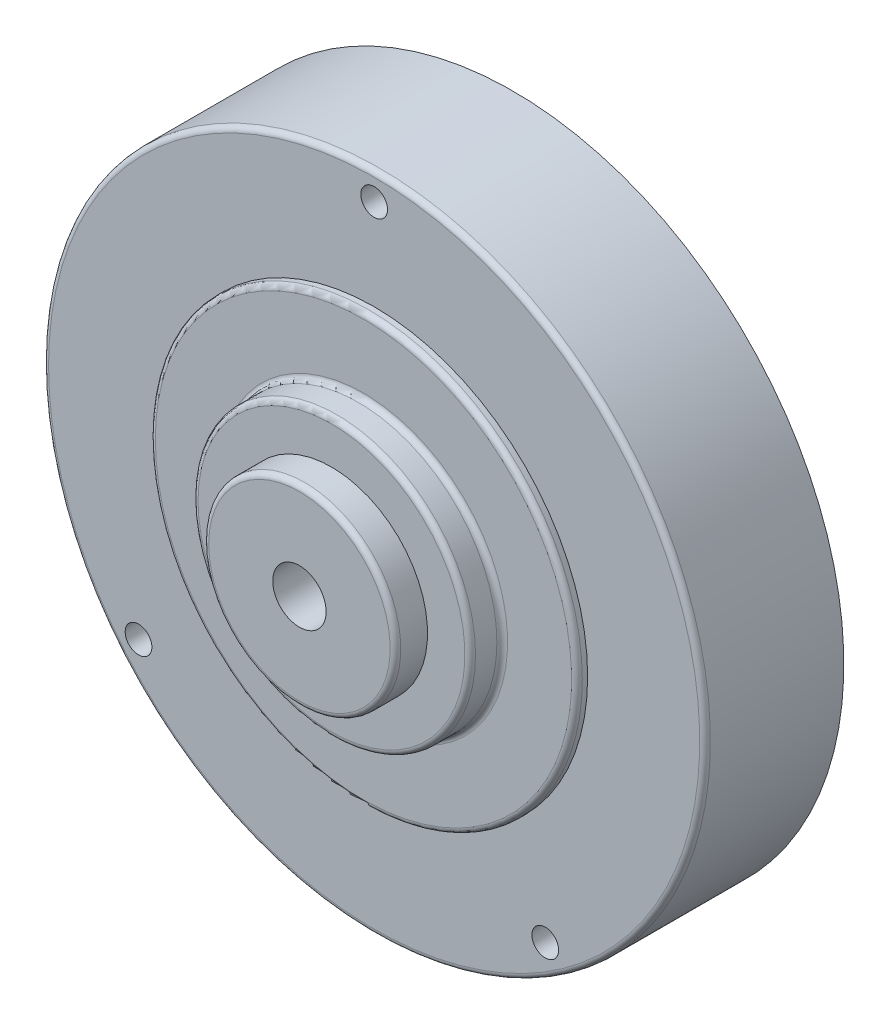
ISO-10303-21;
HEADER;
FILE_DESCRIPTION(('STEP AP214'),'2;1');
FILE_NAME('part.step','',(''),(''),'','','');
FILE_SCHEMA(('AUTOMOTIVE_DESIGN { 1 0 10303 214 1 1 1 1 }'));
ENDSEC;
DATA;
#1=APPLICATION_CONTEXT('core data for automotive mechanical design processes');
#2=APPLICATION_PROTOCOL_DEFINITION('international standard','automotive_design',2000,#1);
#3=PRODUCT_CONTEXT('',#1,'mechanical');
#4=PRODUCT('Part','Part','',(#3));
#5=PRODUCT_RELATED_PRODUCT_CATEGORY('part','',(#4));
#6=PRODUCT_DEFINITION_FORMATION('','',#4);
#7=PRODUCT_DEFINITION_CONTEXT('part definition',#1,'design');
#8=PRODUCT_DEFINITION('design','',#6,#7);
#9=PRODUCT_DEFINITION_SHAPE('','',#8);
#10=(LENGTH_UNIT() NAMED_UNIT(*) SI_UNIT(.MILLI.,.METRE.));
#11=(NAMED_UNIT(*) PLANE_ANGLE_UNIT() SI_UNIT($,.RADIAN.));
#12=(NAMED_UNIT(*) SI_UNIT($,.STERADIAN.) SOLID_ANGLE_UNIT());
#13=UNCERTAINTY_MEASURE_WITH_UNIT(LENGTH_MEASURE(1.E-05),#10,'distance_accuracy_value','');
#14=(GEOMETRIC_REPRESENTATION_CONTEXT(3) GLOBAL_UNCERTAINTY_ASSIGNED_CONTEXT((#13)) GLOBAL_UNIT_ASSIGNED_CONTEXT((#10,
#11,#12)) REPRESENTATION_CONTEXT('',''));
#15=CARTESIAN_POINT('',(0.,0.,0.));
#16=DIRECTION('',(0.,0.,1.));
#17=DIRECTION('',(1.,0.,0.));
#18=AXIS2_PLACEMENT_3D('',#15,#16,#17);
#19=CARTESIAN_POINT('',(0.,0.,0.));
#20=DIRECTION('',(0.,0.,1.));
#21=DIRECTION('',(1.,0.,0.));
#22=AXIS2_PLACEMENT_3D('',#19,#20,#21);
#23=PLANE('',#22);
#24=CARTESIAN_POINT('',(0.,0.,0.));
#25=DIRECTION('',(0.,0.,1.));
#26=DIRECTION('',(1.,0.,0.));
#27=AXIS2_PLACEMENT_3D('',#24,#25,#26);
#28=CIRCLE('',#27,2.5);
#29=CARTESIAN_POINT('',(2.5,0.,0.));
#30=VERTEX_POINT('',#29);
#31=EDGE_CURVE('E77',#30,#30,#28,.T.);
#32=ORIENTED_EDGE('',*,*,#31,.T.);
#33=EDGE_LOOP('',(#32));
#34=FACE_BOUND('',#33,.T.);
#35=CARTESIAN_POINT('',(0.,0.,0.));
#36=DIRECTION('',(0.,0.,-1.));
#37=DIRECTION('',(-1.,0.,0.));
#38=AXIS2_PLACEMENT_3D('',#35,#36,#37);
#39=CIRCLE('',#38,31.);
#40=CARTESIAN_POINT('',(-31.,0.,0.));
#41=VERTEX_POINT('',#40);
#42=EDGE_CURVE('E68',#41,#41,#39,.T.);
#43=ORIENTED_EDGE('',*,*,#42,.T.);
#44=EDGE_LOOP('',(#43));
#45=FACE_BOUND('',#44,.T.);
#46=ADVANCED_FACE('F30',(#34,#45),#23,.F.);
#47=CARTESIAN_POINT('',(0.,0.,0.));
#48=DIRECTION('',(0.,0.,-1.));
#49=DIRECTION('',(-1.,0.,0.));
#50=AXIS2_PLACEMENT_3D('',#47,#48,#49);
#51=CYLINDRICAL_SURFACE('',#50,31.);
#52=CARTESIAN_POINT('',(0.,0.,12.5));
#53=DIRECTION('',(0.,0.,-1.));
#54=DIRECTION('',(-1.,0.,0.));
#55=AXIS2_PLACEMENT_3D('',#52,#53,#54);
#56=CIRCLE('',#55,31.);
#57=CARTESIAN_POINT('',(-31.,0.,12.5));
#58=VERTEX_POINT('',#57);
#59=EDGE_CURVE('E37',#58,#58,#56,.T.);
#60=ORIENTED_EDGE('',*,*,#59,.T.);
#61=EDGE_LOOP('',(#60));
#62=FACE_BOUND('',#61,.T.);
#63=ORIENTED_EDGE('',*,*,#42,.F.);
#64=EDGE_LOOP('',(#63));
#65=FACE_BOUND('',#64,.T.);
#66=ADVANCED_FACE('F115',(#62,#65),#51,.T.);
#67=CARTESIAN_POINT('',(31.,0.,13.));
#68=DIRECTION('',(0.,0.,-1.));
#69=DIRECTION('',(-1.,0.,0.));
#70=AXIS2_PLACEMENT_3D('',#67,#68,#69);
#71=PLANE('',#70);
#72=CARTESIAN_POINT('',(16.0287564116208,-23.5654188992457,13.));
#73=DIRECTION('',(0.,0.,1.));
#74=DIRECTION('',(1.,0.,0.));
#75=AXIS2_PLACEMENT_3D('',#72,#73,#74);
#76=CIRCLE('',#75,1.25);
#77=CARTESIAN_POINT('',(17.2787564116208,-23.5654188992457,13.));
#78=VERTEX_POINT('',#77);
#79=EDGE_CURVE('E96',#78,#78,#76,.T.);
#80=ORIENTED_EDGE('',*,*,#79,.F.);
#81=EDGE_LOOP('',(#80));
#82=FACE_BOUND('',#81,.T.);
#83=CARTESIAN_POINT('',(-22.0713342198514,-18.030701754386,13.));
#84=DIRECTION('',(0.,0.,1.));
#85=DIRECTION('',(1.,0.,0.));
#86=AXIS2_PLACEMENT_3D('',#83,#84,#85);
#87=CIRCLE('',#86,1.25);
#88=CARTESIAN_POINT('',(-20.8213342198514,-18.030701754386,13.));
#89=VERTEX_POINT('',#88);
#90=EDGE_CURVE('E90',#89,#89,#87,.T.);
#91=ORIENTED_EDGE('',*,*,#90,.F.);
#92=EDGE_LOOP('',(#91));
#93=FACE_BOUND('',#92,.T.);
#94=CARTESIAN_POINT('',(0.,28.5,13.));
#95=DIRECTION('',(0.,0.,1.));
#96=DIRECTION('',(1.,0.,0.));
#97=AXIS2_PLACEMENT_3D('',#94,#95,#96);
#98=CIRCLE('',#97,1.25);
#99=CARTESIAN_POINT('',(1.25,28.5,13.));
#100=VERTEX_POINT('',#99);
#101=EDGE_CURVE('E84',#100,#100,#98,.T.);
#102=ORIENTED_EDGE('',*,*,#101,.F.);
#103=EDGE_LOOP('',(#102));
#104=FACE_BOUND('',#103,.T.);
#105=CARTESIAN_POINT('',(0.,0.,13.));
#106=DIRECTION('',(0.,0.,-1.));
#107=DIRECTION('',(-1.,0.,0.));
#108=AXIS2_PLACEMENT_3D('',#105,#106,#107);
#109=CIRCLE('',#108,30.5);
#110=CARTESIAN_POINT('',(-30.5,0.,13.));
#111=VERTEX_POINT('',#110);
#112=EDGE_CURVE('E10',#111,#111,#109,.F.);
#113=ORIENTED_EDGE('',*,*,#112,.T.);
#114=EDGE_LOOP('',(#113));
#115=FACE_BOUND('',#114,.T.);
#116=CARTESIAN_POINT('',(0.,0.,13.));
#117=DIRECTION('',(0.,0.,-1.));
#118=DIRECTION('',(-1.,0.,0.));
#119=AXIS2_PLACEMENT_3D('',#116,#117,#118);
#120=CIRCLE('',#119,20.);
#121=CARTESIAN_POINT('',(-20.,0.,13.));
#122=VERTEX_POINT('',#121);
#123=EDGE_CURVE('E71',#122,#122,#120,.T.);
#124=ORIENTED_EDGE('',*,*,#123,.T.);
#125=EDGE_LOOP('',(#124));
#126=FACE_BOUND('',#125,.T.);
#127=ADVANCED_FACE('F111',(#82,#93,#104,#115,#126),#71,.F.);
#128=CARTESIAN_POINT('',(0.,0.,0.));
#129=DIRECTION('',(0.,0.,-1.));
#130=DIRECTION('',(-1.,0.,0.));
#131=AXIS2_PLACEMENT_3D('',#128,#129,#130);
#132=CYLINDRICAL_SURFACE('',#131,20.);
#133=CARTESIAN_POINT('',(0.,0.,13.5));
#134=DIRECTION('',(0.,0.,-1.));
#135=DIRECTION('',(-1.,0.,0.));
#136=AXIS2_PLACEMENT_3D('',#133,#134,#135);
#137=CIRCLE('',#136,20.);
#138=CARTESIAN_POINT('',(-20.,0.,13.5));
#139=VERTEX_POINT('',#138);
#140=EDGE_CURVE('E41',#139,#139,#137,.T.);
#141=ORIENTED_EDGE('',*,*,#140,.T.);
#142=EDGE_LOOP('',(#141));
#143=FACE_BOUND('',#142,.T.);
#144=ORIENTED_EDGE('',*,*,#123,.F.);
#145=EDGE_LOOP('',(#144));
#146=FACE_BOUND('',#145,.T.);
#147=ADVANCED_FACE('F114',(#143,#146),#132,.T.);
#148=CARTESIAN_POINT('',(20.,0.,14.));
#149=DIRECTION('',(0.,0.,-1.));
#150=DIRECTION('',(-1.,0.,0.));
#151=AXIS2_PLACEMENT_3D('',#148,#149,#150);
#152=PLANE('',#151);
#153=CARTESIAN_POINT('',(0.,0.,14.));
#154=DIRECTION('',(0.,0.,-1.));
#155=DIRECTION('',(-1.,0.,0.));
#156=AXIS2_PLACEMENT_3D('',#153,#154,#155);
#157=CIRCLE('',#156,13.5);
#158=CARTESIAN_POINT('',(-13.5,0.,14.));
#159=VERTEX_POINT('',#158);
#160=EDGE_CURVE('E45',#159,#159,#157,.T.);
#161=ORIENTED_EDGE('',*,*,#160,.T.);
#162=EDGE_LOOP('',(#161));
#163=FACE_BOUND('',#162,.T.);
#164=CARTESIAN_POINT('',(0.,0.,14.));
#165=DIRECTION('',(0.,0.,-1.));
#166=DIRECTION('',(-1.,0.,0.));
#167=AXIS2_PLACEMENT_3D('',#164,#165,#166);
#168=CIRCLE('',#167,19.5);
#169=CARTESIAN_POINT('',(-19.5,0.,14.));
#170=VERTEX_POINT('',#169);
#171=EDGE_CURVE('E50',#170,#170,#168,.F.);
#172=ORIENTED_EDGE('',*,*,#171,.T.);
#173=EDGE_LOOP('',(#172));
#174=FACE_BOUND('',#173,.T.);
#175=ADVANCED_FACE('F124',(#163,#174),#152,.F.);
#176=CARTESIAN_POINT('',(0.,0.,0.));
#177=DIRECTION('',(0.,0.,-1.));
#178=DIRECTION('',(-1.,0.,0.));
#179=AXIS2_PLACEMENT_3D('',#176,#177,#178);
#180=CYLINDRICAL_SURFACE('',#179,13.);
#181=CARTESIAN_POINT('',(0.,0.,16.5));
#182=DIRECTION('',(0.,0.,-1.));
#183=DIRECTION('',(-1.,0.,0.));
#184=AXIS2_PLACEMENT_3D('',#181,#182,#183);
#185=CIRCLE('',#184,13.);
#186=CARTESIAN_POINT('',(-13.,0.,16.5));
#187=VERTEX_POINT('',#186);
#188=EDGE_CURVE('E56',#187,#187,#185,.T.);
#189=ORIENTED_EDGE('',*,*,#188,.T.);
#190=EDGE_LOOP('',(#189));
#191=FACE_BOUND('',#190,.T.);
#192=CARTESIAN_POINT('',(0.,0.,14.5));
#193=DIRECTION('',(0.,0.,-1.));
#194=DIRECTION('',(-1.,0.,0.));
#195=AXIS2_PLACEMENT_3D('',#192,#193,#194);
#196=CIRCLE('',#195,13.);
#197=CARTESIAN_POINT('',(-13.,0.,14.5));
#198=VERTEX_POINT('',#197);
#199=EDGE_CURVE('E59',#198,#198,#196,.F.);
#200=ORIENTED_EDGE('',*,*,#199,.T.);
#201=EDGE_LOOP('',(#200));
#202=FACE_BOUND('',#201,.T.);
#203=ADVANCED_FACE('F130',(#191,#202),#180,.T.);
#204=CARTESIAN_POINT('',(13.,0.,17.));
#205=DIRECTION('',(0.,0.,-1.));
#206=DIRECTION('',(-1.,0.,0.));
#207=AXIS2_PLACEMENT_3D('',#204,#205,#206);
#208=PLANE('',#207);
#209=CARTESIAN_POINT('',(0.,0.,17.));
#210=DIRECTION('',(0.,0.,-1.));
#211=DIRECTION('',(-1.,0.,0.));
#212=AXIS2_PLACEMENT_3D('',#209,#210,#211);
#213=CIRCLE('',#212,12.5);
#214=CARTESIAN_POINT('',(-12.5,0.,17.));
#215=VERTEX_POINT('',#214);
#216=EDGE_CURVE('E53',#215,#215,#213,.F.);
#217=ORIENTED_EDGE('',*,*,#216,.T.);
#218=EDGE_LOOP('',(#217));
#219=FACE_BOUND('',#218,.T.);
#220=CARTESIAN_POINT('',(0.,0.,17.));
#221=DIRECTION('',(0.,0.,-1.));
#222=DIRECTION('',(-1.,0.,0.));
#223=AXIS2_PLACEMENT_3D('',#220,#221,#222);
#224=CIRCLE('',#223,9.);
#225=CARTESIAN_POINT('',(-9.,0.,17.));
#226=VERTEX_POINT('',#225);
#227=EDGE_CURVE('E74',#226,#226,#224,.T.);
#228=ORIENTED_EDGE('',*,*,#227,.T.);
#229=EDGE_LOOP('',(#228));
#230=FACE_BOUND('',#229,.T.);
#231=ADVANCED_FACE('F193',(#219,#230),#208,.F.);
#232=CARTESIAN_POINT('',(0.,0.,0.));
#233=DIRECTION('',(0.,0.,-1.));
#234=DIRECTION('',(-1.,0.,0.));
#235=AXIS2_PLACEMENT_3D('',#232,#233,#234);
#236=CYLINDRICAL_SURFACE('',#235,9.);
#237=CARTESIAN_POINT('',(0.,0.,19.5));
#238=DIRECTION('',(0.,0.,-1.));
#239=DIRECTION('',(-1.,0.,0.));
#240=AXIS2_PLACEMENT_3D('',#237,#238,#239);
#241=CIRCLE('',#240,9.);
#242=CARTESIAN_POINT('',(-9.,0.,19.5));
#243=VERTEX_POINT('',#242);
#244=EDGE_CURVE('E65',#243,#243,#241,.T.);
#245=ORIENTED_EDGE('',*,*,#244,.T.);
#246=EDGE_LOOP('',(#245));
#247=FACE_BOUND('',#246,.T.);
#248=ORIENTED_EDGE('',*,*,#227,.F.);
#249=EDGE_LOOP('',(#248));
#250=FACE_BOUND('',#249,.T.);
#251=ADVANCED_FACE('F189',(#247,#250),#236,.T.);
#252=CARTESIAN_POINT('',(9.,0.,20.));
#253=DIRECTION('',(0.,0.,-1.));
#254=DIRECTION('',(-1.,0.,0.));
#255=AXIS2_PLACEMENT_3D('',#252,#253,#254);
#256=PLANE('',#255);
#257=CARTESIAN_POINT('',(0.,0.,20.));
#258=DIRECTION('',(0.,0.,-1.));
#259=DIRECTION('',(-1.,0.,0.));
#260=AXIS2_PLACEMENT_3D('',#257,#258,#259);
#261=CIRCLE('',#260,8.5);
#262=CARTESIAN_POINT('',(-8.49999999999999,0.,20.));
#263=VERTEX_POINT('',#262);
#264=EDGE_CURVE('E62',#263,#263,#261,.F.);
#265=ORIENTED_EDGE('',*,*,#264,.T.);
#266=EDGE_LOOP('',(#265));
#267=FACE_BOUND('',#266,.T.);
#268=CARTESIAN_POINT('',(0.,0.,20.));
#269=DIRECTION('',(0.,0.,1.));
#270=DIRECTION('',(1.,0.,0.));
#271=AXIS2_PLACEMENT_3D('',#268,#269,#270);
#272=CIRCLE('',#271,2.5);
#273=CARTESIAN_POINT('',(2.5,0.,20.));
#274=VERTEX_POINT('',#273);
#275=EDGE_CURVE('E78',#274,#274,#272,.T.);
#276=ORIENTED_EDGE('',*,*,#275,.F.);
#277=EDGE_LOOP('',(#276));
#278=FACE_BOUND('',#277,.T.);
#279=ADVANCED_FACE('F185',(#267,#278),#256,.F.);
#280=CARTESIAN_POINT('',(0.,0.,0.));
#281=DIRECTION('',(0.,0.,1.));
#282=DIRECTION('',(1.,0.,0.));
#283=AXIS2_PLACEMENT_3D('',#280,#281,#282);
#284=CYLINDRICAL_SURFACE('',#283,2.5);
#285=ORIENTED_EDGE('',*,*,#31,.F.);
#286=EDGE_LOOP('',(#285));
#287=FACE_BOUND('',#286,.T.);
#288=ORIENTED_EDGE('',*,*,#275,.T.);
#289=EDGE_LOOP('',(#288));
#290=FACE_BOUND('',#289,.T.);
#291=ADVANCED_FACE('F146',(#287,#290),#284,.F.);
#292=CARTESIAN_POINT('',(0.,0.,19.5));
#293=DIRECTION('',(0.,0.,-1.));
#294=DIRECTION('',(-1.,0.,0.));
#295=AXIS2_PLACEMENT_3D('',#292,#293,#294);
#296=TOROIDAL_SURFACE('',#295,8.5,0.5);
#297=ORIENTED_EDGE('',*,*,#264,.F.);
#298=EDGE_LOOP('',(#297));
#299=FACE_BOUND('',#298,.T.);
#300=ORIENTED_EDGE('',*,*,#244,.F.);
#301=EDGE_LOOP('',(#300));
#302=FACE_BOUND('',#301,.T.);
#303=ADVANCED_FACE('F142',(#299,#302),#296,.T.);
#304=CARTESIAN_POINT('',(0.,0.,16.5));
#305=DIRECTION('',(0.,0.,-1.));
#306=DIRECTION('',(-1.,0.,0.));
#307=AXIS2_PLACEMENT_3D('',#304,#305,#306);
#308=TOROIDAL_SURFACE('',#307,12.5,0.5);
#309=ORIENTED_EDGE('',*,*,#216,.F.);
#310=EDGE_LOOP('',(#309));
#311=FACE_BOUND('',#310,.T.);
#312=ORIENTED_EDGE('',*,*,#188,.F.);
#313=EDGE_LOOP('',(#312));
#314=FACE_BOUND('',#313,.T.);
#315=ADVANCED_FACE('F145',(#311,#314),#308,.T.);
#316=CARTESIAN_POINT('',(0.,0.,14.5));
#317=DIRECTION('',(0.,0.,-1.));
#318=DIRECTION('',(-1.,0.,0.));
#319=AXIS2_PLACEMENT_3D('',#316,#317,#318);
#320=TOROIDAL_SURFACE('',#319,13.5,0.5);
#321=ORIENTED_EDGE('',*,*,#199,.F.);
#322=EDGE_LOOP('',(#321));
#323=FACE_BOUND('',#322,.T.);
#324=ORIENTED_EDGE('',*,*,#160,.F.);
#325=EDGE_LOOP('',(#324));
#326=FACE_BOUND('',#325,.T.);
#327=ADVANCED_FACE('F150',(#323,#326),#320,.F.);
#328=CARTESIAN_POINT('',(0.,0.,13.5));
#329=DIRECTION('',(0.,0.,-1.));
#330=DIRECTION('',(-1.,0.,0.));
#331=AXIS2_PLACEMENT_3D('',#328,#329,#330);
#332=TOROIDAL_SURFACE('',#331,19.5,0.5);
#333=ORIENTED_EDGE('',*,*,#171,.F.);
#334=EDGE_LOOP('',(#333));
#335=FACE_BOUND('',#334,.T.);
#336=ORIENTED_EDGE('',*,*,#140,.F.);
#337=EDGE_LOOP('',(#336));
#338=FACE_BOUND('',#337,.T.);
#339=ADVANCED_FACE('F153',(#335,#338),#332,.T.);
#340=CARTESIAN_POINT('',(0.,0.,12.5));
#341=DIRECTION('',(0.,0.,-1.));
#342=DIRECTION('',(-1.,0.,0.));
#343=AXIS2_PLACEMENT_3D('',#340,#341,#342);
#344=TOROIDAL_SURFACE('',#343,30.5,0.5);
#345=ORIENTED_EDGE('',*,*,#112,.F.);
#346=EDGE_LOOP('',(#345));
#347=FACE_BOUND('',#346,.T.);
#348=ORIENTED_EDGE('',*,*,#59,.F.);
#349=EDGE_LOOP('',(#348));
#350=FACE_BOUND('',#349,.T.);
#351=ADVANCED_FACE('F32',(#347,#350),#344,.T.);
#352=CARTESIAN_POINT('',(0.,28.5,8.));
#353=DIRECTION('',(0.,0.,1.));
#354=DIRECTION('',(1.,0.,0.));
#355=AXIS2_PLACEMENT_3D('',#352,#353,#354);
#356=CYLINDRICAL_SURFACE('',#355,1.25);
#357=CARTESIAN_POINT('',(0.,28.5,8.));
#358=DIRECTION('',(0.,0.,1.));
#359=DIRECTION('',(1.,0.,0.));
#360=AXIS2_PLACEMENT_3D('',#357,#358,#359);
#361=CIRCLE('',#360,1.25);
#362=CARTESIAN_POINT('',(1.25,28.5,8.));
#363=VERTEX_POINT('',#362);
#364=EDGE_CURVE('E81',#363,#363,#361,.T.);
#365=ORIENTED_EDGE('',*,*,#364,.F.);
#366=EDGE_LOOP('',(#365));
#367=FACE_BOUND('',#366,.T.);
#368=ORIENTED_EDGE('',*,*,#101,.T.);
#369=EDGE_LOOP('',(#368));
#370=FACE_BOUND('',#369,.T.);
#371=ADVANCED_FACE('F160',(#367,#370),#356,.F.);
#372=CARTESIAN_POINT('',(0.,28.5,8.));
#373=DIRECTION('',(0.,0.,1.));
#374=DIRECTION('',(1.,0.,0.));
#375=AXIS2_PLACEMENT_3D('',#372,#373,#374);
#376=PLANE('',#375);
#377=ORIENTED_EDGE('',*,*,#364,.T.);
#378=EDGE_LOOP('',(#377));
#379=FACE_BOUND('',#378,.T.);
#380=ADVANCED_FACE('F169',(#379),#376,.T.);
#381=CARTESIAN_POINT('',(-22.0713342198514,-18.030701754386,8.));
#382=DIRECTION('',(0.,0.,1.));
#383=DIRECTION('',(1.,0.,0.));
#384=AXIS2_PLACEMENT_3D('',#381,#382,#383);
#385=CYLINDRICAL_SURFACE('',#384,1.25);
#386=CARTESIAN_POINT('',(-22.0713342198514,-18.030701754386,8.));
#387=DIRECTION('',(0.,0.,1.));
#388=DIRECTION('',(1.,0.,0.));
#389=AXIS2_PLACEMENT_3D('',#386,#387,#388);
#390=CIRCLE('',#389,1.25);
#391=CARTESIAN_POINT('',(-20.8213342198514,-18.030701754386,8.));
#392=VERTEX_POINT('',#391);
#393=EDGE_CURVE('E87',#392,#392,#390,.T.);
#394=ORIENTED_EDGE('',*,*,#393,.F.);
#395=EDGE_LOOP('',(#394));
#396=FACE_BOUND('',#395,.T.);
#397=ORIENTED_EDGE('',*,*,#90,.T.);
#398=EDGE_LOOP('',(#397));
#399=FACE_BOUND('',#398,.T.);
#400=ADVANCED_FACE('F176',(#396,#399),#385,.F.);
#401=CARTESIAN_POINT('',(-22.0713342198514,-18.030701754386,8.));
#402=DIRECTION('',(0.,0.,1.));
#403=DIRECTION('',(1.,0.,0.));
#404=AXIS2_PLACEMENT_3D('',#401,#402,#403);
#405=PLANE('',#404);
#406=ORIENTED_EDGE('',*,*,#393,.T.);
#407=EDGE_LOOP('',(#406));
#408=FACE_BOUND('',#407,.T.);
#409=ADVANCED_FACE('F107',(#408),#405,.T.);
#410=CARTESIAN_POINT('',(16.0287564116208,-23.5654188992457,8.));
#411=DIRECTION('',(0.,0.,1.));
#412=DIRECTION('',(1.,0.,0.));
#413=AXIS2_PLACEMENT_3D('',#410,#411,#412);
#414=CYLINDRICAL_SURFACE('',#413,1.25);
#415=CARTESIAN_POINT('',(16.0287564116208,-23.5654188992457,8.));
#416=DIRECTION('',(0.,0.,1.));
#417=DIRECTION('',(1.,0.,0.));
#418=AXIS2_PLACEMENT_3D('',#415,#416,#417);
#419=CIRCLE('',#418,1.25);
#420=CARTESIAN_POINT('',(17.2787564116208,-23.5654188992457,8.));
#421=VERTEX_POINT('',#420);
#422=EDGE_CURVE('E93',#421,#421,#419,.T.);
#423=ORIENTED_EDGE('',*,*,#422,.F.);
#424=EDGE_LOOP('',(#423));
#425=FACE_BOUND('',#424,.T.);
#426=ORIENTED_EDGE('',*,*,#79,.T.);
#427=EDGE_LOOP('',(#426));
#428=FACE_BOUND('',#427,.T.);
#429=ADVANCED_FACE('F104',(#425,#428),#414,.F.);
#430=CARTESIAN_POINT('',(16.0287564116208,-23.5654188992457,8.));
#431=DIRECTION('',(0.,0.,1.));
#432=DIRECTION('',(1.,0.,0.));
#433=AXIS2_PLACEMENT_3D('',#430,#431,#432);
#434=PLANE('',#433);
#435=ORIENTED_EDGE('',*,*,#422,.T.);
#436=EDGE_LOOP('',(#435));
#437=FACE_BOUND('',#436,.T.);
#438=ADVANCED_FACE('F102',(#437),#434,.T.);
#439=CLOSED_SHELL('',(#46,#66,#127,#147,#175,#203,#231,#251,#279,#291,#303,#315,#327,#339,#351,
#371,#380,#400,#409,#429,#438));
#440=MANIFOLD_SOLID_BREP('B2',#439);
#441=ADVANCED_BREP_SHAPE_REPRESENTATION('',(#18,#440),#14);
#442=SHAPE_DEFINITION_REPRESENTATION(#9,#441);
ENDSEC;
END-ISO-10303-21;
